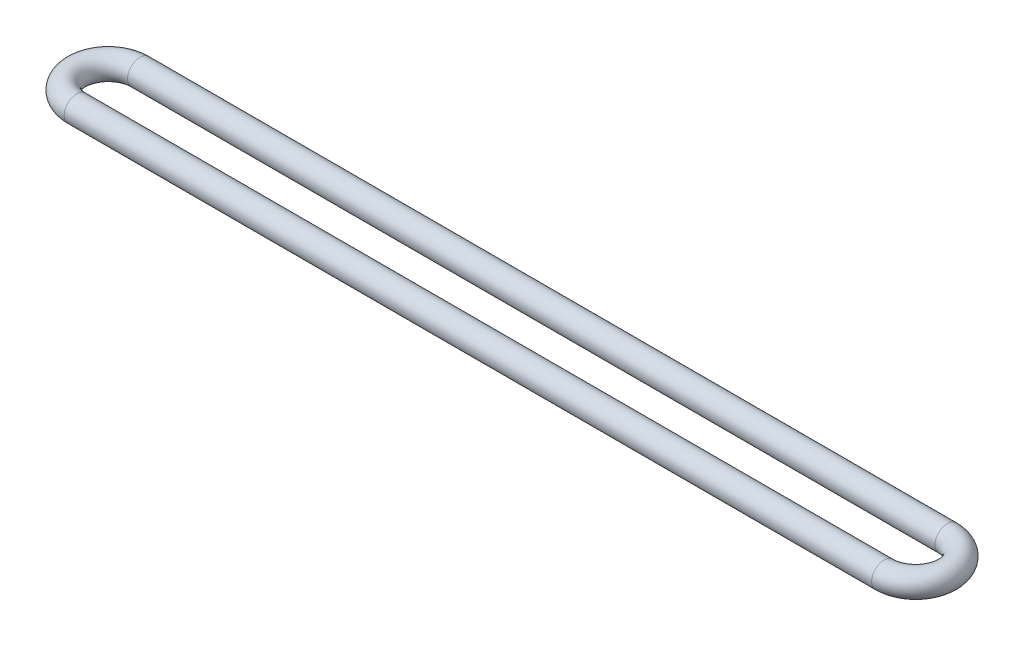
ISO-10303-21;
HEADER;
FILE_DESCRIPTION(('STEP AP214'),'2;1');
FILE_NAME('part.step','',(''),(''),'','','');
FILE_SCHEMA(('AUTOMOTIVE_DESIGN { 1 0 10303 214 1 1 1 1 }'));
ENDSEC;
DATA;
#1=APPLICATION_CONTEXT('core data for automotive mechanical design processes');
#2=APPLICATION_PROTOCOL_DEFINITION('international standard','automotive_design',2000,#1);
#3=PRODUCT_CONTEXT('',#1,'mechanical');
#4=PRODUCT('Part','Part','',(#3));
#5=PRODUCT_RELATED_PRODUCT_CATEGORY('part','',(#4));
#6=PRODUCT_DEFINITION_FORMATION('','',#4);
#7=PRODUCT_DEFINITION_CONTEXT('part definition',#1,'design');
#8=PRODUCT_DEFINITION('design','',#6,#7);
#9=PRODUCT_DEFINITION_SHAPE('','',#8);
#10=(LENGTH_UNIT() NAMED_UNIT(*) SI_UNIT(.MILLI.,.METRE.));
#11=(NAMED_UNIT(*) PLANE_ANGLE_UNIT() SI_UNIT($,.RADIAN.));
#12=(NAMED_UNIT(*) SI_UNIT($,.STERADIAN.) SOLID_ANGLE_UNIT());
#13=UNCERTAINTY_MEASURE_WITH_UNIT(LENGTH_MEASURE(1.E-05),#10,'distance_accuracy_value','');
#14=(GEOMETRIC_REPRESENTATION_CONTEXT(3) GLOBAL_UNCERTAINTY_ASSIGNED_CONTEXT((#13)) GLOBAL_UNIT_ASSIGNED_CONTEXT((#10,
#11,#12)) REPRESENTATION_CONTEXT('',''));
#15=CARTESIAN_POINT('',(0.,0.,0.));
#16=DIRECTION('',(0.,0.,1.));
#17=DIRECTION('',(1.,0.,0.));
#18=AXIS2_PLACEMENT_3D('',#15,#16,#17);
#19=CARTESIAN_POINT('',(0.,0.,2.55000000000001));
#20=DIRECTION('',(0.,-1.,0.));
#21=DIRECTION('',(0.,0.,-1.));
#22=AXIS2_PLACEMENT_3D('',#19,#20,#21);
#23=TOROIDAL_SURFACE('',#22,2.55000000000001,1.);
#24=CARTESIAN_POINT('',(0.,0.,5.10000000000001));
#25=DIRECTION('',(-1.,0.,0.));
#26=DIRECTION('',(0.,0.,1.));
#27=AXIS2_PLACEMENT_3D('',#24,#25,#26);
#28=CIRCLE('',#27,1.);
#29=CARTESIAN_POINT('',(0.,0.,6.10000000000001));
#30=VERTEX_POINT('',#29);
#31=EDGE_CURVE('E41',#30,#30,#28,.T.);
#32=ORIENTED_EDGE('',*,*,#31,.T.);
#33=EDGE_LOOP('',(#32));
#34=FACE_BOUND('',#33,.T.);
#35=CARTESIAN_POINT('',(0.,0.,0.));
#36=DIRECTION('',(1.,0.,0.));
#37=DIRECTION('',(0.,0.,-1.));
#38=AXIS2_PLACEMENT_3D('',#35,#36,#37);
#39=CIRCLE('',#38,1.);
#40=CARTESIAN_POINT('',(0.,0.,-1.));
#41=VERTEX_POINT('',#40);
#42=EDGE_CURVE('E10',#41,#41,#39,.T.);
#43=ORIENTED_EDGE('',*,*,#42,.F.);
#44=EDGE_LOOP('',(#43));
#45=FACE_BOUND('',#44,.T.);
#46=ADVANCED_FACE('F31',(#34,#45),#23,.T.);
#47=CARTESIAN_POINT('',(65.,0.,5.1));
#48=DIRECTION('',(-1.,0.,0.));
#49=DIRECTION('',(0.,0.,1.));
#50=AXIS2_PLACEMENT_3D('',#47,#48,#49);
#51=CYLINDRICAL_SURFACE('',#50,1.);
#52=CARTESIAN_POINT('',(65.,0.,5.1));
#53=DIRECTION('',(-1.,0.,0.));
#54=DIRECTION('',(0.,0.,1.));
#55=AXIS2_PLACEMENT_3D('',#52,#53,#54);
#56=CIRCLE('',#55,1.);
#57=CARTESIAN_POINT('',(65.,0.,6.1));
#58=VERTEX_POINT('',#57);
#59=EDGE_CURVE('E45',#58,#58,#56,.T.);
#60=ORIENTED_EDGE('',*,*,#59,.T.);
#61=EDGE_LOOP('',(#60));
#62=FACE_BOUND('',#61,.T.);
#63=ORIENTED_EDGE('',*,*,#31,.F.);
#64=EDGE_LOOP('',(#63));
#65=FACE_BOUND('',#64,.T.);
#66=ADVANCED_FACE('F64',(#62,#65),#51,.T.);
#67=CARTESIAN_POINT('',(65.,0.,2.55));
#68=DIRECTION('',(0.,-1.,0.));
#69=DIRECTION('',(0.,0.,-1.));
#70=AXIS2_PLACEMENT_3D('',#67,#68,#69);
#71=TOROIDAL_SURFACE('',#70,2.55,1.);
#72=CARTESIAN_POINT('',(65.,0.,0.));
#73=DIRECTION('',(1.,0.,0.));
#74=DIRECTION('',(0.,0.,-1.));
#75=AXIS2_PLACEMENT_3D('',#72,#73,#74);
#76=CIRCLE('',#75,1.);
#77=CARTESIAN_POINT('',(65.,0.,-1.));
#78=VERTEX_POINT('',#77);
#79=EDGE_CURVE('E50',#78,#78,#76,.T.);
#80=CARTESIAN_POINT('',(65.,0.,2.55));
#81=DIRECTION('',(0.,-1.,0.));
#82=DIRECTION('',(0.,0.,-1.));
#83=AXIS2_PLACEMENT_3D('',#80,#81,#82);
#84=CIRCLE('',#83,3.55);
#85=EDGE_CURVE('',#78,#58,#84,.T.);
#86=ORIENTED_EDGE('',*,*,#79,.T.);
#87=ORIENTED_EDGE('',*,*,#59,.F.);
#88=ORIENTED_EDGE('',*,*,#85,.T.);
#89=ORIENTED_EDGE('',*,*,#85,.F.);
#90=EDGE_LOOP('',(#86,#88,#87,#89));
#91=FACE_BOUND('',#90,.T.);
#92=ADVANCED_FACE('F68',(#91),#71,.T.);
#93=CARTESIAN_POINT('',(65.,0.,0.));
#94=DIRECTION('',(-1.,0.,0.));
#95=DIRECTION('',(0.,0.,1.));
#96=AXIS2_PLACEMENT_3D('',#93,#94,#95);
#97=CYLINDRICAL_SURFACE('',#96,1.);
#98=ORIENTED_EDGE('',*,*,#79,.F.);
#99=EDGE_LOOP('',(#98));
#100=FACE_BOUND('',#99,.T.);
#101=ORIENTED_EDGE('',*,*,#42,.T.);
#102=EDGE_LOOP('',(#101));
#103=FACE_BOUND('',#102,.T.);
#104=ADVANCED_FACE('F73',(#100,#103),#97,.T.);
#105=CLOSED_SHELL('',(#46,#66,#92,#104));
#106=MANIFOLD_SOLID_BREP('B2',#105);
#107=ADVANCED_BREP_SHAPE_REPRESENTATION('',(#18,#106),#14);
#108=SHAPE_DEFINITION_REPRESENTATION(#9,#107);
ENDSEC;
END-ISO-10303-21;
